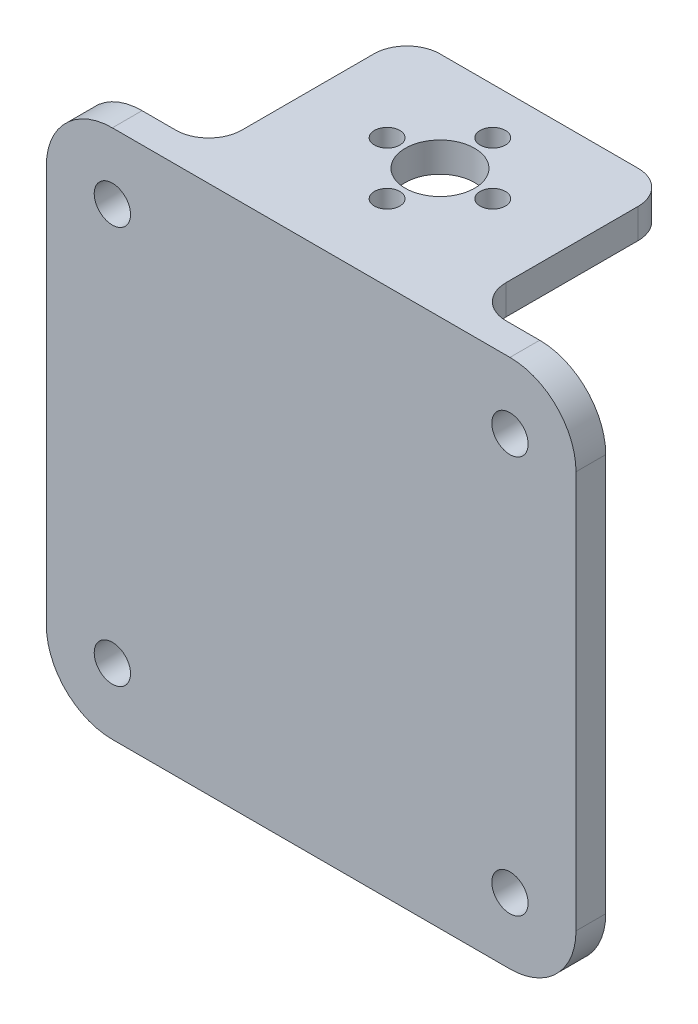
ISO-10303-21;
HEADER;
FILE_DESCRIPTION(('STEP AP214'),'2;1');
FILE_NAME('part.step','',(''),(''),'','','');
FILE_SCHEMA(('AUTOMOTIVE_DESIGN { 1 0 10303 214 1 1 1 1 }'));
ENDSEC;
DATA;
#1=APPLICATION_CONTEXT('core data for automotive mechanical design processes');
#2=APPLICATION_PROTOCOL_DEFINITION('international standard','automotive_design',2000,#1);
#3=PRODUCT_CONTEXT('',#1,'mechanical');
#4=PRODUCT('Part','Part','',(#3));
#5=PRODUCT_RELATED_PRODUCT_CATEGORY('part','',(#4));
#6=PRODUCT_DEFINITION_FORMATION('','',#4);
#7=PRODUCT_DEFINITION_CONTEXT('part definition',#1,'design');
#8=PRODUCT_DEFINITION('design','',#6,#7);
#9=PRODUCT_DEFINITION_SHAPE('','',#8);
#10=(LENGTH_UNIT() NAMED_UNIT(*) SI_UNIT(.MILLI.,.METRE.));
#11=(NAMED_UNIT(*) PLANE_ANGLE_UNIT() SI_UNIT($,.RADIAN.));
#12=(NAMED_UNIT(*) SI_UNIT($,.STERADIAN.) SOLID_ANGLE_UNIT());
#13=UNCERTAINTY_MEASURE_WITH_UNIT(LENGTH_MEASURE(1.E-05),#10,'distance_accuracy_value','');
#14=(GEOMETRIC_REPRESENTATION_CONTEXT(3) GLOBAL_UNCERTAINTY_ASSIGNED_CONTEXT((#13)) GLOBAL_UNIT_ASSIGNED_CONTEXT((#10,
#11,#12)) REPRESENTATION_CONTEXT('',''));
#15=CARTESIAN_POINT('',(0.,0.,0.));
#16=DIRECTION('',(0.,0.,1.));
#17=DIRECTION('',(1.,0.,0.));
#18=AXIS2_PLACEMENT_3D('',#15,#16,#17);
#19=CARTESIAN_POINT('',(-20.,30.6,-5.));
#20=DIRECTION('',(-1.,0.,0.));
#21=DIRECTION('',(0.,0.,1.));
#22=AXIS2_PLACEMENT_3D('',#19,#20,#21);
#23=CYLINDRICAL_SURFACE('',#22,5.);
#24=CARTESIAN_POINT('',(-5.15388203202207,35.6,-5.));
#25=CARTESIAN_POINT('',(-5.01631585307418,35.5999913520222,-4.92909748437577));
#26=CARTESIAN_POINT('',(-4.87729618481996,35.5984918317113,-4.86104360331751));
#27=CARTESIAN_POINT('',(-4.59662063585491,35.5931730594894,-4.73074971215315));
#28=CARTESIAN_POINT('',(-4.45496507521269,35.5893540874635,-4.66850900162467));
#29=CARTESIAN_POINT('',(-4.16928792933621,35.5800591686286,-4.5499544788145));
#30=CARTESIAN_POINT('',(-4.02526689375377,35.5745836017426,-4.49363931155772));
#31=CARTESIAN_POINT('',(-3.73507167214751,35.5625711685309,-4.38700593165495));
#32=CARTESIAN_POINT('',(-3.58889741871085,35.5560342689127,-4.33668790721748));
#33=CARTESIAN_POINT('',(-3.14793667536414,35.5356971252103,-4.19499227552404));
#34=CARTESIAN_POINT('',(-2.85021765370454,35.521150451921,-4.11266800465306));
#35=CARTESIAN_POINT('',(-2.24896964163665,35.4938599669087,-3.9727640340968));
#36=CARTESIAN_POINT('',(-1.94544052656638,35.4811161939182,-3.91518486596805));
#37=CARTESIAN_POINT('',(-1.33022773066185,35.4600921647358,-3.82453626447683));
#38=CARTESIAN_POINT('',(-1.01848936514312,35.4518767149964,-3.79182027441572));
#39=CARTESIAN_POINT('',(-0.393262608097474,35.4419203855534,-3.75251326105764));
#40=CARTESIAN_POINT('',(-0.0797742174207513,35.4401795027047,-3.74592222506991));
#41=CARTESIAN_POINT('',(0.546542452032286,35.4435278052012,-3.75891990886592));
#42=CARTESIAN_POINT('',(0.859370871986203,35.4486153405969,-3.77850230436263));
#43=CARTESIAN_POINT('',(1.4821451200631,35.4645675365453,-3.84366708453228));
#44=CARTESIAN_POINT('',(1.79209106484402,35.4754319622545,-3.88924841229596));
#45=CARTESIAN_POINT('',(2.36483910949621,35.4988481249681,-3.99804573617424));
#46=CARTESIAN_POINT('',(2.62828650735949,35.5109652759137,-4.05799343173408));
#47=CARTESIAN_POINT('',(3.1501282352049,35.5355457485927,-4.19666400796702));
#48=CARTESIAN_POINT('',(3.40852341513045,35.5480090112303,-4.27538370067178));
#49=CARTESIAN_POINT('',(3.91920957374872,35.5705919525803,-4.45129194136026));
#50=CARTESIAN_POINT('',(4.17149803584348,35.5807106793465,-4.54848796218717));
#51=CARTESIAN_POINT('',(4.54430028552803,35.5917355745811,-4.70776416277608));
#52=CARTESIAN_POINT('',(4.66766066692802,35.5947185758424,-4.76311942076407));
#53=CARTESIAN_POINT('',(4.91234180293186,35.5988488127952,-4.87825703348604));
#54=CARTESIAN_POINT('',(5.0336623689234,35.59999587964,-4.93803979487847));
#55=CARTESIAN_POINT('',(5.15388203202208,35.6,-5.));
#56=B_SPLINE_CURVE_WITH_KNOTS('',3,(#24,#25,#26,#27,#28,#29,#30,#31,#32,#33,#34,#35,#36,#37,#38,
#39,#40,#41,#42,#43,#44,#45,#46,#47,#48,#49,#50,#51,#52,#53,#54,#55),.UNSPECIFIED.,.F.,.F.,(4,2,
2,2,2,2,2,2,2,2,2,2,2,2,2,4),(0.,0.464230022958836,0.928404039009597,1.39247168213864,
1.85655388528336,2.78311591250001,3.70969784246144,4.64921720773792,5.58873611662203,
6.52802805055899,7.46728180309712,8.27795648921143,9.08849359981811,9.89935923640951,
10.3050032539503,10.7106845755039),.UNSPECIFIED.);
#57=CARTESIAN_POINT('',(-5.15388203202208,35.6,-5.));
#58=VERTEX_POINT('',#57);
#59=CARTESIAN_POINT('',(5.15388203202208,35.6,-5.));
#60=VERTEX_POINT('',#59);
#61=EDGE_CURVE('E160',#58,#60,#56,.T.);
#62=ORIENTED_EDGE('',*,*,#61,.T.);
#63=DIRECTION('',(-1.,0.,0.));
#64=VECTOR('',#63,1.);
#65=CARTESIAN_POINT('',(-20.,35.6,-5.));
#66=LINE('',#65,#64);
#67=CARTESIAN_POINT('',(20.,35.6,-5.));
#68=VERTEX_POINT('',#67);
#69=EDGE_CURVE('E168',#68,#60,#66,.T.);
#70=ORIENTED_EDGE('',*,*,#69,.F.);
#71=CARTESIAN_POINT('',(25.,30.6,-5.));
#72=DIRECTION('',(-0.707106781186548,-0.707106781186547,0.));
#73=DIRECTION('',(-0.707106781186547,0.707106781186548,0.));
#74=AXIS2_PLACEMENT_3D('',#71,#72,#73);
#75=ELLIPSE('',#74,7.07106781186547,5.);
#76=CARTESIAN_POINT('',(25.,30.6,0.));
#77=VERTEX_POINT('',#76);
#78=EDGE_CURVE('E47',#68,#77,#75,.F.);
#79=ORIENTED_EDGE('',*,*,#78,.T.);
#80=DIRECTION('',(-1.,0.,0.));
#81=VECTOR('',#80,1.);
#82=CARTESIAN_POINT('',(0.,30.6,0.));
#83=LINE('',#82,#81);
#84=CARTESIAN_POINT('',(-25.,30.6,0.));
#85=VERTEX_POINT('',#84);
#86=EDGE_CURVE('E60',#85,#77,#83,.F.);
#87=ORIENTED_EDGE('',*,*,#86,.F.);
#88=CARTESIAN_POINT('',(-25.,30.6,-5.));
#89=DIRECTION('',(-0.707106781186548,0.707106781186547,0.));
#90=DIRECTION('',(-0.707106781186547,-0.707106781186548,0.));
#91=AXIS2_PLACEMENT_3D('',#88,#89,#90);
#92=ELLIPSE('',#91,7.07106781186547,5.);
#93=CARTESIAN_POINT('',(-20.,35.6,-5.));
#94=VERTEX_POINT('',#93);
#95=EDGE_CURVE('E212',#85,#94,#92,.T.);
#96=ORIENTED_EDGE('',*,*,#95,.T.);
#97=EDGE_CURVE('E169',#58,#94,#66,.T.);
#98=ORIENTED_EDGE('',*,*,#97,.F.);
#99=EDGE_LOOP('',(#62,#70,#79,#87,#96,#98));
#100=FACE_BOUND('',#99,.T.);
#101=ADVANCED_FACE('F39',(#100),#23,.F.);
#102=CARTESIAN_POINT('',(40.1,-40.1,4.5));
#103=DIRECTION('',(-1.,0.,0.));
#104=DIRECTION('',(0.,0.,1.));
#105=AXIS2_PLACEMENT_3D('',#102,#103,#104);
#106=PLANE('',#105);
#107=DIRECTION('',(0.,1.,0.));
#108=VECTOR('',#107,1.);
#109=CARTESIAN_POINT('',(40.1,-40.1,4.5));
#110=LINE('',#109,#108);
#111=CARTESIAN_POINT('',(40.1,-30.1,4.5));
#112=VERTEX_POINT('',#111);
#113=CARTESIAN_POINT('',(40.1,30.1,4.5));
#114=VERTEX_POINT('',#113);
#115=EDGE_CURVE('E240',#112,#114,#110,.T.);
#116=ORIENTED_EDGE('',*,*,#115,.F.);
#117=DIRECTION('',(0.,0.,-1.));
#118=VECTOR('',#117,1.);
#119=CARTESIAN_POINT('',(40.1,-30.1,4.5));
#120=LINE('',#119,#118);
#121=CARTESIAN_POINT('',(40.1,-30.1,0.));
#122=VERTEX_POINT('',#121);
#123=EDGE_CURVE('E243',#112,#122,#120,.T.);
#124=ORIENTED_EDGE('',*,*,#123,.T.);
#125=DIRECTION('',(0.,1.,0.));
#126=VECTOR('',#125,1.);
#127=CARTESIAN_POINT('',(40.1,-40.1,0.));
#128=LINE('',#127,#126);
#129=CARTESIAN_POINT('',(40.1,30.1,0.));
#130=VERTEX_POINT('',#129);
#131=EDGE_CURVE('E234',#122,#130,#128,.T.);
#132=ORIENTED_EDGE('',*,*,#131,.T.);
#133=DIRECTION('',(0.,0.,-1.));
#134=VECTOR('',#133,1.);
#135=CARTESIAN_POINT('',(40.1,30.1,4.5));
#136=LINE('',#135,#134);
#137=EDGE_CURVE('E241',#130,#114,#136,.F.);
#138=ORIENTED_EDGE('',*,*,#137,.T.);
#139=EDGE_LOOP('',(#116,#124,#132,#138));
#140=FACE_BOUND('',#139,.T.);
#141=ADVANCED_FACE('F448',(#140),#106,.F.);
#142=CARTESIAN_POINT('',(-40.1,40.1,4.5));
#143=DIRECTION('',(0.,-1.,0.));
#144=DIRECTION('',(0.,0.,-1.));
#145=AXIS2_PLACEMENT_3D('',#142,#143,#144);
#146=PLANE('',#145);
#147=CARTESIAN_POINT('',(0.,40.1,-23.));
#148=DIRECTION('',(0.,-1.,0.));
#149=DIRECTION('',(0.,0.,-1.));
#150=AXIS2_PLACEMENT_3D('',#147,#148,#149);
#151=CIRCLE('',#150,1.92451726462189);
#152=CARTESIAN_POINT('',(0.,40.1,-24.9245172646219));
#153=VERTEX_POINT('',#152);
#154=EDGE_CURVE('E351',#153,#153,#151,.F.);
#155=ORIENTED_EDGE('',*,*,#154,.F.);
#156=EDGE_LOOP('',(#155));
#157=FACE_BOUND('',#156,.T.);
#158=CARTESIAN_POINT('',(-8.,40.1,-15.));
#159=DIRECTION('',(0.,-1.,0.));
#160=DIRECTION('',(0.,0.,-1.));
#161=AXIS2_PLACEMENT_3D('',#158,#159,#160);
#162=CIRCLE('',#161,1.92451726462189);
#163=CARTESIAN_POINT('',(-8.,40.1,-16.9245172646219));
#164=VERTEX_POINT('',#163);
#165=EDGE_CURVE('E364',#164,#164,#162,.F.);
#166=ORIENTED_EDGE('',*,*,#165,.F.);
#167=EDGE_LOOP('',(#166));
#168=FACE_BOUND('',#167,.T.);
#169=CARTESIAN_POINT('',(0.,40.1,-7.));
#170=DIRECTION('',(0.,-1.,0.));
#171=DIRECTION('',(0.,0.,-1.));
#172=AXIS2_PLACEMENT_3D('',#169,#170,#171);
#173=CIRCLE('',#172,1.92451726462189);
#174=CARTESIAN_POINT('',(0.,40.1,-8.9245172646219));
#175=VERTEX_POINT('',#174);
#176=EDGE_CURVE('E358',#175,#175,#173,.F.);
#177=ORIENTED_EDGE('',*,*,#176,.F.);
#178=EDGE_LOOP('',(#177));
#179=FACE_BOUND('',#178,.T.);
#180=CARTESIAN_POINT('',(8.,40.1,-15.));
#181=DIRECTION('',(0.,-1.,0.));
#182=DIRECTION('',(0.,0.,-1.));
#183=AXIS2_PLACEMENT_3D('',#180,#181,#182);
#184=CIRCLE('',#183,1.92451726462189);
#185=CARTESIAN_POINT('',(8.,40.1,-16.9245172646219));
#186=VERTEX_POINT('',#185);
#187=EDGE_CURVE('E352',#186,#186,#184,.F.);
#188=ORIENTED_EDGE('',*,*,#187,.F.);
#189=EDGE_LOOP('',(#188));
#190=FACE_BOUND('',#189,.T.);
#191=CARTESIAN_POINT('',(0.,40.1,-15.));
#192=DIRECTION('',(0.,-1.,0.));
#193=DIRECTION('',(0.,0.,-1.));
#194=AXIS2_PLACEMENT_3D('',#191,#192,#193);
#195=CIRCLE('',#194,5.25);
#196=CARTESIAN_POINT('',(0.,40.1,-20.25));
#197=VERTEX_POINT('',#196);
#198=EDGE_CURVE('E345',#197,#197,#195,.F.);
#199=ORIENTED_EDGE('',*,*,#198,.F.);
#200=EDGE_LOOP('',(#199));
#201=FACE_BOUND('',#200,.T.);
#202=DIRECTION('',(1.,0.,0.));
#203=VECTOR('',#202,1.);
#204=CARTESIAN_POINT('',(-20.,40.1,-30.));
#205=LINE('',#204,#203);
#206=CARTESIAN_POINT('',(-15.,40.1,-30.));
#207=VERTEX_POINT('',#206);
#208=CARTESIAN_POINT('',(15.,40.1,-30.));
#209=VERTEX_POINT('',#208);
#210=EDGE_CURVE('E342',#207,#209,#205,.T.);
#211=ORIENTED_EDGE('',*,*,#210,.F.);
#212=CARTESIAN_POINT('',(-15.,40.1,-25.));
#213=DIRECTION('',(0.,-1.,0.));
#214=DIRECTION('',(0.,0.,-1.));
#215=AXIS2_PLACEMENT_3D('',#212,#213,#214);
#216=CIRCLE('',#215,5.);
#217=CARTESIAN_POINT('',(-20.,40.1,-25.));
#218=VERTEX_POINT('',#217);
#219=EDGE_CURVE('E190',#207,#218,#216,.F.);
#220=ORIENTED_EDGE('',*,*,#219,.T.);
#221=DIRECTION('',(0.,0.,1.));
#222=VECTOR('',#221,1.);
#223=CARTESIAN_POINT('',(-20.,40.1,-30.));
#224=LINE('',#223,#222);
#225=CARTESIAN_POINT('',(-20.,40.1,-5.));
#226=VERTEX_POINT('',#225);
#227=EDGE_CURVE('E330',#218,#226,#224,.T.);
#228=ORIENTED_EDGE('',*,*,#227,.T.);
#229=CARTESIAN_POINT('',(-25.,40.1,-5.));
#230=DIRECTION('',(0.,-1.,0.));
#231=DIRECTION('',(0.,0.,-1.));
#232=AXIS2_PLACEMENT_3D('',#229,#230,#231);
#233=CIRCLE('',#232,5.);
#234=CARTESIAN_POINT('',(-25.,40.1,0.));
#235=VERTEX_POINT('',#234);
#236=EDGE_CURVE('E210',#226,#235,#233,.T.);
#237=ORIENTED_EDGE('',*,*,#236,.T.);
#238=DIRECTION('',(-1.,0.,0.));
#239=VECTOR('',#238,1.);
#240=CARTESIAN_POINT('',(-40.1,40.1,0.));
#241=LINE('',#240,#239);
#242=CARTESIAN_POINT('',(-30.1,40.1,0.));
#243=VERTEX_POINT('',#242);
#244=EDGE_CURVE('E229',#235,#243,#241,.T.);
#245=ORIENTED_EDGE('',*,*,#244,.T.);
#246=DIRECTION('',(0.,0.,-1.));
#247=VECTOR('',#246,1.);
#248=CARTESIAN_POINT('',(-30.1,40.1,4.5));
#249=LINE('',#248,#247);
#250=CARTESIAN_POINT('',(-30.1,40.1,4.5));
#251=VERTEX_POINT('',#250);
#252=EDGE_CURVE('E179',#243,#251,#249,.F.);
#253=ORIENTED_EDGE('',*,*,#252,.T.);
#254=DIRECTION('',(-1.,0.,0.));
#255=VECTOR('',#254,1.);
#256=CARTESIAN_POINT('',(-40.1,40.1,4.5));
#257=LINE('',#256,#255);
#258=CARTESIAN_POINT('',(30.1,40.1,4.5));
#259=VERTEX_POINT('',#258);
#260=EDGE_CURVE('E275',#259,#251,#257,.T.);
#261=ORIENTED_EDGE('',*,*,#260,.F.);
#262=DIRECTION('',(0.,0.,-1.));
#263=VECTOR('',#262,1.);
#264=CARTESIAN_POINT('',(30.1,40.1,4.5));
#265=LINE('',#264,#263);
#266=CARTESIAN_POINT('',(30.1,40.1,0.));
#267=VERTEX_POINT('',#266);
#268=EDGE_CURVE('E227',#259,#267,#265,.T.);
#269=ORIENTED_EDGE('',*,*,#268,.T.);
#270=CARTESIAN_POINT('',(25.,40.1,0.));
#271=VERTEX_POINT('',#270);
#272=EDGE_CURVE('E221',#267,#271,#241,.T.);
#273=ORIENTED_EDGE('',*,*,#272,.T.);
#274=CARTESIAN_POINT('',(25.,40.1,-5.));
#275=DIRECTION('',(0.,-1.,0.));
#276=DIRECTION('',(0.,0.,-1.));
#277=AXIS2_PLACEMENT_3D('',#274,#275,#276);
#278=CIRCLE('',#277,5.);
#279=CARTESIAN_POINT('',(20.,40.1,-5.));
#280=VERTEX_POINT('',#279);
#281=EDGE_CURVE('E11',#271,#280,#278,.T.);
#282=ORIENTED_EDGE('',*,*,#281,.T.);
#283=DIRECTION('',(0.,0.,1.));
#284=VECTOR('',#283,1.);
#285=CARTESIAN_POINT('',(20.,40.1,-30.));
#286=LINE('',#285,#284);
#287=CARTESIAN_POINT('',(20.,40.1,-25.));
#288=VERTEX_POINT('',#287);
#289=EDGE_CURVE('E333',#288,#280,#286,.T.);
#290=ORIENTED_EDGE('',*,*,#289,.F.);
#291=CARTESIAN_POINT('',(15.,40.1,-25.));
#292=DIRECTION('',(0.,-1.,0.));
#293=DIRECTION('',(0.,0.,-1.));
#294=AXIS2_PLACEMENT_3D('',#291,#292,#293);
#295=CIRCLE('',#294,5.);
#296=EDGE_CURVE('E188',#288,#209,#295,.F.);
#297=ORIENTED_EDGE('',*,*,#296,.T.);
#298=EDGE_LOOP('',(#211,#220,#228,#237,#245,#253,#261,#269,#273,#282,#290,#297));
#299=FACE_BOUND('',#298,.T.);
#300=ADVANCED_FACE('F224',(#157,#168,#179,#190,#201,#299),#146,.F.);
#301=CARTESIAN_POINT('',(-40.1,-40.1,4.5));
#302=DIRECTION('',(1.,0.,0.));
#303=DIRECTION('',(0.,0.,-1.));
#304=AXIS2_PLACEMENT_3D('',#301,#302,#303);
#305=PLANE('',#304);
#306=DIRECTION('',(0.,-1.,0.));
#307=VECTOR('',#306,1.);
#308=CARTESIAN_POINT('',(-40.1,-40.1,0.));
#309=LINE('',#308,#307);
#310=CARTESIAN_POINT('',(-40.1,30.1,0.));
#311=VERTEX_POINT('',#310);
#312=CARTESIAN_POINT('',(-40.1,-30.1,0.));
#313=VERTEX_POINT('',#312);
#314=EDGE_CURVE('E228',#311,#313,#309,.T.);
#315=ORIENTED_EDGE('',*,*,#314,.T.);
#316=DIRECTION('',(0.,0.,-1.));
#317=VECTOR('',#316,1.);
#318=CARTESIAN_POINT('',(-40.1,-30.1,4.5));
#319=LINE('',#318,#317);
#320=CARTESIAN_POINT('',(-40.1,-30.1,4.5));
#321=VERTEX_POINT('',#320);
#322=EDGE_CURVE('E272',#313,#321,#319,.F.);
#323=ORIENTED_EDGE('',*,*,#322,.T.);
#324=DIRECTION('',(0.,-1.,0.));
#325=VECTOR('',#324,1.);
#326=CARTESIAN_POINT('',(-40.1,-40.1,4.5));
#327=LINE('',#326,#325);
#328=CARTESIAN_POINT('',(-40.1,30.1,4.5));
#329=VERTEX_POINT('',#328);
#330=EDGE_CURVE('E285',#329,#321,#327,.T.);
#331=ORIENTED_EDGE('',*,*,#330,.F.);
#332=DIRECTION('',(0.,0.,-1.));
#333=VECTOR('',#332,1.);
#334=CARTESIAN_POINT('',(-40.1,30.1,4.5));
#335=LINE('',#334,#333);
#336=EDGE_CURVE('E269',#329,#311,#335,.T.);
#337=ORIENTED_EDGE('',*,*,#336,.T.);
#338=EDGE_LOOP('',(#315,#323,#331,#337));
#339=FACE_BOUND('',#338,.T.);
#340=ADVANCED_FACE('F291',(#339),#305,.F.);
#341=CARTESIAN_POINT('',(-40.1,-40.1,4.5));
#342=DIRECTION('',(0.,1.,0.));
#343=DIRECTION('',(0.,0.,1.));
#344=AXIS2_PLACEMENT_3D('',#341,#342,#343);
#345=PLANE('',#344);
#346=DIRECTION('',(1.,0.,0.));
#347=VECTOR('',#346,1.);
#348=CARTESIAN_POINT('',(-40.1,-40.1,0.));
#349=LINE('',#348,#347);
#350=CARTESIAN_POINT('',(-30.1,-40.1,0.));
#351=VERTEX_POINT('',#350);
#352=CARTESIAN_POINT('',(30.1,-40.1,0.));
#353=VERTEX_POINT('',#352);
#354=EDGE_CURVE('E232',#351,#353,#349,.T.);
#355=ORIENTED_EDGE('',*,*,#354,.T.);
#356=DIRECTION('',(0.,0.,-1.));
#357=VECTOR('',#356,1.);
#358=CARTESIAN_POINT('',(30.1,-40.1,4.5));
#359=LINE('',#358,#357);
#360=CARTESIAN_POINT('',(30.1,-40.1,4.5));
#361=VERTEX_POINT('',#360);
#362=EDGE_CURVE('E259',#353,#361,#359,.F.);
#363=ORIENTED_EDGE('',*,*,#362,.T.);
#364=DIRECTION('',(1.,0.,0.));
#365=VECTOR('',#364,1.);
#366=CARTESIAN_POINT('',(-40.1,-40.1,4.5));
#367=LINE('',#366,#365);
#368=CARTESIAN_POINT('',(-30.1,-40.1,4.5));
#369=VERTEX_POINT('',#368);
#370=EDGE_CURVE('E244',#369,#361,#367,.T.);
#371=ORIENTED_EDGE('',*,*,#370,.F.);
#372=DIRECTION('',(0.,0.,-1.));
#373=VECTOR('',#372,1.);
#374=CARTESIAN_POINT('',(-30.1,-40.1,4.5));
#375=LINE('',#374,#373);
#376=EDGE_CURVE('E256',#369,#351,#375,.T.);
#377=ORIENTED_EDGE('',*,*,#376,.T.);
#378=EDGE_LOOP('',(#355,#363,#371,#377));
#379=FACE_BOUND('',#378,.T.);
#380=ADVANCED_FACE('F300',(#379),#345,.F.);
#381=CARTESIAN_POINT('',(0.,0.,4.5));
#382=DIRECTION('',(0.,0.,-1.));
#383=DIRECTION('',(-1.,0.,0.));
#384=AXIS2_PLACEMENT_3D('',#381,#382,#383);
#385=PLANE('',#384);
#386=CARTESIAN_POINT('',(30.1,30.1,4.5));
#387=DIRECTION('',(0.,0.,-1.));
#388=DIRECTION('',(-1.,0.,0.));
#389=AXIS2_PLACEMENT_3D('',#386,#387,#388);
#390=CIRCLE('',#389,2.74999999999999);
#391=CARTESIAN_POINT('',(27.35,30.1,4.5));
#392=VERTEX_POINT('',#391);
#393=EDGE_CURVE('E324',#392,#392,#390,.T.);
#394=ORIENTED_EDGE('',*,*,#393,.T.);
#395=EDGE_LOOP('',(#394));
#396=FACE_BOUND('',#395,.T.);
#397=CARTESIAN_POINT('',(-30.1,30.1,4.5));
#398=DIRECTION('',(0.,0.,-1.));
#399=DIRECTION('',(-1.,0.,0.));
#400=AXIS2_PLACEMENT_3D('',#397,#398,#399);
#401=CIRCLE('',#400,2.75);
#402=CARTESIAN_POINT('',(-32.85,30.1,4.5));
#403=VERTEX_POINT('',#402);
#404=EDGE_CURVE('E318',#403,#403,#401,.T.);
#405=ORIENTED_EDGE('',*,*,#404,.T.);
#406=EDGE_LOOP('',(#405));
#407=FACE_BOUND('',#406,.T.);
#408=CARTESIAN_POINT('',(30.1,-30.1,4.5));
#409=DIRECTION('',(0.,0.,-1.));
#410=DIRECTION('',(-1.,0.,0.));
#411=AXIS2_PLACEMENT_3D('',#408,#409,#410);
#412=CIRCLE('',#411,2.75);
#413=CARTESIAN_POINT('',(27.35,-30.1,4.5));
#414=VERTEX_POINT('',#413);
#415=EDGE_CURVE('E312',#414,#414,#412,.T.);
#416=ORIENTED_EDGE('',*,*,#415,.T.);
#417=EDGE_LOOP('',(#416));
#418=FACE_BOUND('',#417,.T.);
#419=CARTESIAN_POINT('',(-30.1,-30.1,4.5));
#420=DIRECTION('',(0.,0.,-1.));
#421=DIRECTION('',(-1.,0.,0.));
#422=AXIS2_PLACEMENT_3D('',#419,#420,#421);
#423=CIRCLE('',#422,2.75);
#424=CARTESIAN_POINT('',(-32.85,-30.1,4.5));
#425=VERTEX_POINT('',#424);
#426=EDGE_CURVE('E306',#425,#425,#423,.T.);
#427=ORIENTED_EDGE('',*,*,#426,.T.);
#428=EDGE_LOOP('',(#427));
#429=FACE_BOUND('',#428,.T.);
#430=ORIENTED_EDGE('',*,*,#370,.T.);
#431=CARTESIAN_POINT('',(30.1,-30.1,4.5));
#432=DIRECTION('',(0.,0.,-1.));
#433=DIRECTION('',(-1.,0.,0.));
#434=AXIS2_PLACEMENT_3D('',#431,#432,#433);
#435=CIRCLE('',#434,10.);
#436=EDGE_CURVE('E267',#361,#112,#435,.F.);
#437=ORIENTED_EDGE('',*,*,#436,.T.);
#438=ORIENTED_EDGE('',*,*,#115,.T.);
#439=CARTESIAN_POINT('',(30.1,30.1,4.5));
#440=DIRECTION('',(0.,0.,-1.));
#441=DIRECTION('',(-1.,0.,0.));
#442=AXIS2_PLACEMENT_3D('',#439,#440,#441);
#443=CIRCLE('',#442,10.);
#444=EDGE_CURVE('E261',#114,#259,#443,.F.);
#445=ORIENTED_EDGE('',*,*,#444,.T.);
#446=ORIENTED_EDGE('',*,*,#260,.T.);
#447=CARTESIAN_POINT('',(-30.1,30.1,4.5));
#448=DIRECTION('',(0.,0.,-1.));
#449=DIRECTION('',(-1.,0.,0.));
#450=AXIS2_PLACEMENT_3D('',#447,#448,#449);
#451=CIRCLE('',#450,10.);
#452=EDGE_CURVE('E263',#251,#329,#451,.F.);
#453=ORIENTED_EDGE('',*,*,#452,.T.);
#454=ORIENTED_EDGE('',*,*,#330,.T.);
#455=CARTESIAN_POINT('',(-30.1,-30.1,4.5));
#456=DIRECTION('',(0.,0.,-1.));
#457=DIRECTION('',(-1.,0.,0.));
#458=AXIS2_PLACEMENT_3D('',#455,#456,#457);
#459=CIRCLE('',#458,10.);
#460=EDGE_CURVE('E265',#321,#369,#459,.F.);
#461=ORIENTED_EDGE('',*,*,#460,.T.);
#462=EDGE_LOOP('',(#430,#437,#438,#445,#446,#453,#454,#461));
#463=FACE_BOUND('',#462,.T.);
#464=ADVANCED_FACE('F280',(#396,#407,#418,#429,#463),#385,.F.);
#465=CARTESIAN_POINT('',(0.,0.,0.));
#466=DIRECTION('',(0.,0.,-1.));
#467=DIRECTION('',(-1.,0.,0.));
#468=AXIS2_PLACEMENT_3D('',#465,#466,#467);
#469=PLANE('',#468);
#470=ORIENTED_EDGE('',*,*,#244,.F.);
#471=DIRECTION('',(0.,1.,0.));
#472=VECTOR('',#471,1.);
#473=CARTESIAN_POINT('',(-25.,0.,0.));
#474=LINE('',#473,#472);
#475=EDGE_CURVE('E205',#235,#85,#474,.F.);
#476=ORIENTED_EDGE('',*,*,#475,.T.);
#477=ORIENTED_EDGE('',*,*,#86,.T.);
#478=DIRECTION('',(0.,-1.,0.));
#479=VECTOR('',#478,1.);
#480=CARTESIAN_POINT('',(25.,0.,0.));
#481=LINE('',#480,#479);
#482=EDGE_CURVE('E203',#77,#271,#481,.F.);
#483=ORIENTED_EDGE('',*,*,#482,.T.);
#484=ORIENTED_EDGE('',*,*,#272,.F.);
#485=CARTESIAN_POINT('',(30.1,30.1,0.));
#486=DIRECTION('',(0.,0.,-1.));
#487=DIRECTION('',(-1.,0.,0.));
#488=AXIS2_PLACEMENT_3D('',#485,#486,#487);
#489=CIRCLE('',#488,10.);
#490=EDGE_CURVE('E247',#267,#130,#489,.T.);
#491=ORIENTED_EDGE('',*,*,#490,.T.);
#492=ORIENTED_EDGE('',*,*,#131,.F.);
#493=CARTESIAN_POINT('',(30.1,-30.1,0.));
#494=DIRECTION('',(0.,0.,-1.));
#495=DIRECTION('',(-1.,0.,0.));
#496=AXIS2_PLACEMENT_3D('',#493,#494,#495);
#497=CIRCLE('',#496,10.);
#498=EDGE_CURVE('E254',#122,#353,#497,.T.);
#499=ORIENTED_EDGE('',*,*,#498,.T.);
#500=ORIENTED_EDGE('',*,*,#354,.F.);
#501=CARTESIAN_POINT('',(-30.1,-30.1,0.));
#502=DIRECTION('',(0.,0.,-1.));
#503=DIRECTION('',(-1.,0.,0.));
#504=AXIS2_PLACEMENT_3D('',#501,#502,#503);
#505=CIRCLE('',#504,10.);
#506=EDGE_CURVE('E252',#351,#313,#505,.T.);
#507=ORIENTED_EDGE('',*,*,#506,.T.);
#508=ORIENTED_EDGE('',*,*,#314,.F.);
#509=CARTESIAN_POINT('',(-30.1,30.1,0.));
#510=DIRECTION('',(0.,0.,-1.));
#511=DIRECTION('',(-1.,0.,0.));
#512=AXIS2_PLACEMENT_3D('',#509,#510,#511);
#513=CIRCLE('',#512,10.);
#514=EDGE_CURVE('E249',#311,#243,#513,.T.);
#515=ORIENTED_EDGE('',*,*,#514,.T.);
#516=EDGE_LOOP('',(#470,#476,#477,#483,#484,#491,#492,#499,#500,#507,#508,#515));
#517=FACE_BOUND('',#516,.T.);
#518=CARTESIAN_POINT('',(30.1,30.1,0.));
#519=DIRECTION('',(0.,0.,-1.));
#520=DIRECTION('',(-1.,0.,0.));
#521=AXIS2_PLACEMENT_3D('',#518,#519,#520);
#522=CIRCLE('',#521,2.74999999999998);
#523=CARTESIAN_POINT('',(27.35,30.1,0.));
#524=VERTEX_POINT('',#523);
#525=EDGE_CURVE('E327',#524,#524,#522,.T.);
#526=ORIENTED_EDGE('',*,*,#525,.F.);
#527=EDGE_LOOP('',(#526));
#528=FACE_BOUND('',#527,.T.);
#529=CARTESIAN_POINT('',(-30.1,30.1,0.));
#530=DIRECTION('',(0.,0.,-1.));
#531=DIRECTION('',(-1.,0.,0.));
#532=AXIS2_PLACEMENT_3D('',#529,#530,#531);
#533=CIRCLE('',#532,2.74999999999999);
#534=CARTESIAN_POINT('',(-32.85,30.1,0.));
#535=VERTEX_POINT('',#534);
#536=EDGE_CURVE('E321',#535,#535,#533,.T.);
#537=ORIENTED_EDGE('',*,*,#536,.F.);
#538=EDGE_LOOP('',(#537));
#539=FACE_BOUND('',#538,.T.);
#540=CARTESIAN_POINT('',(30.1,-30.1,0.));
#541=DIRECTION('',(0.,0.,-1.));
#542=DIRECTION('',(-1.,0.,0.));
#543=AXIS2_PLACEMENT_3D('',#540,#541,#542);
#544=CIRCLE('',#543,2.74999999999999);
#545=CARTESIAN_POINT('',(27.35,-30.1,0.));
#546=VERTEX_POINT('',#545);
#547=EDGE_CURVE('E315',#546,#546,#544,.T.);
#548=ORIENTED_EDGE('',*,*,#547,.F.);
#549=EDGE_LOOP('',(#548));
#550=FACE_BOUND('',#549,.T.);
#551=CARTESIAN_POINT('',(-30.1,-30.1,0.));
#552=DIRECTION('',(0.,0.,-1.));
#553=DIRECTION('',(-1.,0.,0.));
#554=AXIS2_PLACEMENT_3D('',#551,#552,#553);
#555=CIRCLE('',#554,2.74999999999999);
#556=CARTESIAN_POINT('',(-32.85,-30.1,0.));
#557=VERTEX_POINT('',#556);
#558=EDGE_CURVE('E309',#557,#557,#555,.T.);
#559=ORIENTED_EDGE('',*,*,#558,.F.);
#560=EDGE_LOOP('',(#559));
#561=FACE_BOUND('',#560,.T.);
#562=ADVANCED_FACE('F219',(#517,#528,#539,#550,#561),#469,.T.);
#563=CARTESIAN_POINT('',(-30.1,-30.1,0.));
#564=DIRECTION('',(0.,0.,-1.));
#565=DIRECTION('',(-1.,0.,0.));
#566=AXIS2_PLACEMENT_3D('',#563,#564,#565);
#567=CYLINDRICAL_SURFACE('',#566,2.74999999999999);
#568=ORIENTED_EDGE('',*,*,#426,.F.);
#569=EDGE_LOOP('',(#568));
#570=FACE_BOUND('',#569,.T.);
#571=ORIENTED_EDGE('',*,*,#558,.T.);
#572=EDGE_LOOP('',(#571));
#573=FACE_BOUND('',#572,.T.);
#574=ADVANCED_FACE('F432',(#570,#573),#567,.F.);
#575=CARTESIAN_POINT('',(30.1,-30.1,0.));
#576=DIRECTION('',(0.,0.,-1.));
#577=DIRECTION('',(-1.,0.,0.));
#578=AXIS2_PLACEMENT_3D('',#575,#576,#577);
#579=CYLINDRICAL_SURFACE('',#578,2.74999999999999);
#580=ORIENTED_EDGE('',*,*,#415,.F.);
#581=EDGE_LOOP('',(#580));
#582=FACE_BOUND('',#581,.T.);
#583=ORIENTED_EDGE('',*,*,#547,.T.);
#584=EDGE_LOOP('',(#583));
#585=FACE_BOUND('',#584,.T.);
#586=ADVANCED_FACE('F428',(#582,#585),#579,.F.);
#587=CARTESIAN_POINT('',(-30.1,30.1,0.));
#588=DIRECTION('',(0.,0.,-1.));
#589=DIRECTION('',(-1.,0.,0.));
#590=AXIS2_PLACEMENT_3D('',#587,#588,#589);
#591=CYLINDRICAL_SURFACE('',#590,2.74999999999999);
#592=ORIENTED_EDGE('',*,*,#404,.F.);
#593=EDGE_LOOP('',(#592));
#594=FACE_BOUND('',#593,.T.);
#595=ORIENTED_EDGE('',*,*,#536,.T.);
#596=EDGE_LOOP('',(#595));
#597=FACE_BOUND('',#596,.T.);
#598=ADVANCED_FACE('F424',(#594,#597),#591,.F.);
#599=CARTESIAN_POINT('',(30.1,30.1,0.));
#600=DIRECTION('',(0.,0.,-1.));
#601=DIRECTION('',(-1.,0.,0.));
#602=AXIS2_PLACEMENT_3D('',#599,#600,#601);
#603=CYLINDRICAL_SURFACE('',#602,2.74999999999999);
#604=ORIENTED_EDGE('',*,*,#393,.F.);
#605=EDGE_LOOP('',(#604));
#606=FACE_BOUND('',#605,.T.);
#607=ORIENTED_EDGE('',*,*,#525,.T.);
#608=EDGE_LOOP('',(#607));
#609=FACE_BOUND('',#608,.T.);
#610=ADVANCED_FACE('F420',(#606,#609),#603,.F.);
#611=CARTESIAN_POINT('',(-20.,40.1,-30.));
#612=DIRECTION('',(1.,0.,0.));
#613=DIRECTION('',(0.,1.,0.));
#614=AXIS2_PLACEMENT_3D('',#611,#612,#613);
#615=PLANE('',#614);
#616=DIRECTION('',(0.,0.,1.));
#617=VECTOR('',#616,1.);
#618=CARTESIAN_POINT('',(-20.,35.6,-30.));
#619=LINE('',#618,#617);
#620=CARTESIAN_POINT('',(-20.,35.6,-25.));
#621=VERTEX_POINT('',#620);
#622=EDGE_CURVE('E336',#621,#94,#619,.T.);
#623=ORIENTED_EDGE('',*,*,#622,.T.);
#624=DIRECTION('',(0.,1.,0.));
#625=VECTOR('',#624,1.);
#626=CARTESIAN_POINT('',(-20.,40.1,-5.));
#627=LINE('',#626,#625);
#628=EDGE_CURVE('E200',#94,#226,#627,.T.);
#629=ORIENTED_EDGE('',*,*,#628,.T.);
#630=ORIENTED_EDGE('',*,*,#227,.F.);
#631=DIRECTION('',(0.,1.,0.));
#632=VECTOR('',#631,1.);
#633=CARTESIAN_POINT('',(-20.,40.1,-25.));
#634=LINE('',#633,#632);
#635=EDGE_CURVE('E192',#218,#621,#634,.F.);
#636=ORIENTED_EDGE('',*,*,#635,.T.);
#637=EDGE_LOOP('',(#623,#629,#630,#636));
#638=FACE_BOUND('',#637,.T.);
#639=ADVANCED_FACE('F416',(#638),#615,.F.);
#640=CARTESIAN_POINT('',(20.,40.1,-30.));
#641=DIRECTION('',(-1.,0.,0.));
#642=DIRECTION('',(0.,-1.,0.));
#643=AXIS2_PLACEMENT_3D('',#640,#641,#642);
#644=PLANE('',#643);
#645=ORIENTED_EDGE('',*,*,#289,.T.);
#646=DIRECTION('',(0.,-1.,0.));
#647=VECTOR('',#646,1.);
#648=CARTESIAN_POINT('',(20.,40.1,-5.));
#649=LINE('',#648,#647);
#650=EDGE_CURVE('E207',#280,#68,#649,.T.);
#651=ORIENTED_EDGE('',*,*,#650,.T.);
#652=DIRECTION('',(0.,0.,1.));
#653=VECTOR('',#652,1.);
#654=CARTESIAN_POINT('',(20.,35.6,-30.));
#655=LINE('',#654,#653);
#656=CARTESIAN_POINT('',(20.,35.6,-25.));
#657=VERTEX_POINT('',#656);
#658=EDGE_CURVE('E175',#657,#68,#655,.T.);
#659=ORIENTED_EDGE('',*,*,#658,.F.);
#660=DIRECTION('',(0.,-1.,0.));
#661=VECTOR('',#660,1.);
#662=CARTESIAN_POINT('',(20.,40.1,-25.));
#663=LINE('',#662,#661);
#664=EDGE_CURVE('E198',#657,#288,#663,.F.);
#665=ORIENTED_EDGE('',*,*,#664,.T.);
#666=EDGE_LOOP('',(#645,#651,#659,#665));
#667=FACE_BOUND('',#666,.T.);
#668=ADVANCED_FACE('F412',(#667),#644,.F.);
#669=CARTESIAN_POINT('',(-20.,35.6,-30.));
#670=DIRECTION('',(0.,1.,0.));
#671=DIRECTION('',(0.,0.,1.));
#672=AXIS2_PLACEMENT_3D('',#669,#670,#671);
#673=PLANE('',#672);
#674=CARTESIAN_POINT('',(0.,35.6,-23.));
#675=DIRECTION('',(0.,-1.,0.));
#676=DIRECTION('',(0.,0.,-1.));
#677=AXIS2_PLACEMENT_3D('',#674,#675,#676);
#678=CIRCLE('',#677,1.92451726462189);
#679=CARTESIAN_POINT('',(0.,35.6,-24.9245172646219));
#680=VERTEX_POINT('',#679);
#681=EDGE_CURVE('E367',#680,#680,#678,.T.);
#682=ORIENTED_EDGE('',*,*,#681,.F.);
#683=EDGE_LOOP('',(#682));
#684=FACE_BOUND('',#683,.T.);
#685=CARTESIAN_POINT('',(-8.,35.6,-15.));
#686=DIRECTION('',(0.,-1.,0.));
#687=DIRECTION('',(0.,0.,-1.));
#688=AXIS2_PLACEMENT_3D('',#685,#686,#687);
#689=CIRCLE('',#688,1.92451726462189);
#690=CARTESIAN_POINT('',(-8.,35.6,-16.9245172646219));
#691=VERTEX_POINT('',#690);
#692=EDGE_CURVE('E361',#691,#691,#689,.T.);
#693=ORIENTED_EDGE('',*,*,#692,.F.);
#694=EDGE_LOOP('',(#693));
#695=FACE_BOUND('',#694,.T.);
#696=CARTESIAN_POINT('',(0.,35.6,-7.));
#697=DIRECTION('',(0.,-1.,0.));
#698=DIRECTION('',(0.,0.,-1.));
#699=AXIS2_PLACEMENT_3D('',#696,#697,#698);
#700=CIRCLE('',#699,1.92451726462189);
#701=CARTESIAN_POINT('',(0.,35.6,-8.9245172646219));
#702=VERTEX_POINT('',#701);
#703=EDGE_CURVE('E355',#702,#702,#700,.T.);
#704=ORIENTED_EDGE('',*,*,#703,.F.);
#705=EDGE_LOOP('',(#704));
#706=FACE_BOUND('',#705,.T.);
#707=CARTESIAN_POINT('',(8.,35.6,-15.));
#708=DIRECTION('',(0.,-1.,0.));
#709=DIRECTION('',(0.,0.,-1.));
#710=AXIS2_PLACEMENT_3D('',#707,#708,#709);
#711=CIRCLE('',#710,1.92451726462189);
#712=CARTESIAN_POINT('',(8.,35.6,-16.9245172646219));
#713=VERTEX_POINT('',#712);
#714=EDGE_CURVE('E165',#713,#713,#711,.T.);
#715=ORIENTED_EDGE('',*,*,#714,.F.);
#716=EDGE_LOOP('',(#715));
#717=FACE_BOUND('',#716,.T.);
#718=CARTESIAN_POINT('',(0.,35.6,-15.));
#719=DIRECTION('',(0.,-1.,0.));
#720=DIRECTION('',(0.,0.,-1.));
#721=AXIS2_PLACEMENT_3D('',#718,#719,#720);
#722=CIRCLE('',#721,5.25);
#723=CARTESIAN_POINT('',(0.,35.6,-20.25));
#724=VERTEX_POINT('',#723);
#725=EDGE_CURVE('E348',#724,#724,#722,.T.);
#726=ORIENTED_EDGE('',*,*,#725,.F.);
#727=EDGE_LOOP('',(#726));
#728=FACE_BOUND('',#727,.T.);
#729=ORIENTED_EDGE('',*,*,#622,.F.);
#730=CARTESIAN_POINT('',(-15.,35.6,-25.));
#731=DIRECTION('',(0.,1.,0.));
#732=DIRECTION('',(0.,0.,1.));
#733=AXIS2_PLACEMENT_3D('',#730,#731,#732);
#734=CIRCLE('',#733,5.);
#735=CARTESIAN_POINT('',(-15.,35.6,-30.));
#736=VERTEX_POINT('',#735);
#737=EDGE_CURVE('E196',#621,#736,#734,.F.);
#738=ORIENTED_EDGE('',*,*,#737,.T.);
#739=DIRECTION('',(-1.,0.,0.));
#740=VECTOR('',#739,1.);
#741=CARTESIAN_POINT('',(-20.,35.6,-30.));
#742=LINE('',#741,#740);
#743=CARTESIAN_POINT('',(15.,35.6,-30.));
#744=VERTEX_POINT('',#743);
#745=EDGE_CURVE('E339',#744,#736,#742,.T.);
#746=ORIENTED_EDGE('',*,*,#745,.F.);
#747=CARTESIAN_POINT('',(15.,35.6,-25.));
#748=DIRECTION('',(0.,1.,0.));
#749=DIRECTION('',(0.,0.,1.));
#750=AXIS2_PLACEMENT_3D('',#747,#748,#749);
#751=CIRCLE('',#750,5.);
#752=EDGE_CURVE('E194',#744,#657,#751,.F.);
#753=ORIENTED_EDGE('',*,*,#752,.T.);
#754=ORIENTED_EDGE('',*,*,#658,.T.);
#755=ORIENTED_EDGE('',*,*,#69,.T.);
#756=CARTESIAN_POINT('',(0.,35.6,-15.));
#757=DIRECTION('',(0.,-1.,0.));
#758=DIRECTION('',(0.,0.,-1.));
#759=AXIS2_PLACEMENT_3D('',#756,#757,#758);
#760=CIRCLE('',#759,11.25);
#761=EDGE_CURVE('E157',#60,#58,#760,.T.);
#762=ORIENTED_EDGE('',*,*,#761,.T.);
#763=ORIENTED_EDGE('',*,*,#97,.T.);
#764=EDGE_LOOP('',(#729,#738,#746,#753,#754,#755,#762,#763));
#765=FACE_BOUND('',#764,.T.);
#766=ADVANCED_FACE('F173',(#684,#695,#706,#717,#728,#765),#673,.F.);
#767=CARTESIAN_POINT('',(0.,0.,-30.));
#768=DIRECTION('',(0.,0.,1.));
#769=DIRECTION('',(1.,0.,0.));
#770=AXIS2_PLACEMENT_3D('',#767,#768,#769);
#771=PLANE('',#770);
#772=ORIENTED_EDGE('',*,*,#745,.T.);
#773=DIRECTION('',(0.,1.,0.));
#774=VECTOR('',#773,1.);
#775=CARTESIAN_POINT('',(-15.,0.,-30.));
#776=LINE('',#775,#774);
#777=EDGE_CURVE('E185',#736,#207,#776,.T.);
#778=ORIENTED_EDGE('',*,*,#777,.T.);
#779=ORIENTED_EDGE('',*,*,#210,.T.);
#780=DIRECTION('',(0.,-1.,0.));
#781=VECTOR('',#780,1.);
#782=CARTESIAN_POINT('',(15.,0.,-30.));
#783=LINE('',#782,#781);
#784=EDGE_CURVE('E177',#209,#744,#783,.T.);
#785=ORIENTED_EDGE('',*,*,#784,.T.);
#786=EDGE_LOOP('',(#772,#778,#779,#785));
#787=FACE_BOUND('',#786,.T.);
#788=ADVANCED_FACE('F405',(#787),#771,.F.);
#789=CARTESIAN_POINT('',(0.,40.101,-15.));
#790=DIRECTION('',(0.,-1.,0.));
#791=DIRECTION('',(0.,0.,-1.));
#792=AXIS2_PLACEMENT_3D('',#789,#790,#791);
#793=CYLINDRICAL_SURFACE('',#792,5.25);
#794=ORIENTED_EDGE('',*,*,#725,.T.);
#795=EDGE_LOOP('',(#794));
#796=FACE_BOUND('',#795,.T.);
#797=ORIENTED_EDGE('',*,*,#198,.T.);
#798=EDGE_LOOP('',(#797));
#799=FACE_BOUND('',#798,.T.);
#800=ADVANCED_FACE('F401',(#796,#799),#793,.F.);
#801=CARTESIAN_POINT('',(8.,40.101,-15.));
#802=DIRECTION('',(0.,-1.,0.));
#803=DIRECTION('',(0.,0.,-1.));
#804=AXIS2_PLACEMENT_3D('',#801,#802,#803);
#805=CYLINDRICAL_SURFACE('',#804,1.92451726462189);
#806=ORIENTED_EDGE('',*,*,#714,.T.);
#807=EDGE_LOOP('',(#806));
#808=FACE_BOUND('',#807,.T.);
#809=ORIENTED_EDGE('',*,*,#187,.T.);
#810=EDGE_LOOP('',(#809));
#811=FACE_BOUND('',#810,.T.);
#812=ADVANCED_FACE('F397',(#808,#811),#805,.F.);
#813=CARTESIAN_POINT('',(0.,40.101,-7.));
#814=DIRECTION('',(0.,-1.,0.));
#815=DIRECTION('',(0.,0.,-1.));
#816=AXIS2_PLACEMENT_3D('',#813,#814,#815);
#817=CYLINDRICAL_SURFACE('',#816,1.92451726462189);
#818=ORIENTED_EDGE('',*,*,#703,.T.);
#819=EDGE_LOOP('',(#818));
#820=FACE_BOUND('',#819,.T.);
#821=ORIENTED_EDGE('',*,*,#176,.T.);
#822=EDGE_LOOP('',(#821));
#823=FACE_BOUND('',#822,.T.);
#824=ADVANCED_FACE('F393',(#820,#823),#817,.F.);
#825=CARTESIAN_POINT('',(-8.,40.101,-15.));
#826=DIRECTION('',(0.,-1.,0.));
#827=DIRECTION('',(0.,0.,-1.));
#828=AXIS2_PLACEMENT_3D('',#825,#826,#827);
#829=CYLINDRICAL_SURFACE('',#828,1.92451726462189);
#830=ORIENTED_EDGE('',*,*,#692,.T.);
#831=EDGE_LOOP('',(#830));
#832=FACE_BOUND('',#831,.T.);
#833=ORIENTED_EDGE('',*,*,#165,.T.);
#834=EDGE_LOOP('',(#833));
#835=FACE_BOUND('',#834,.T.);
#836=ADVANCED_FACE('F389',(#832,#835),#829,.F.);
#837=CARTESIAN_POINT('',(0.,40.101,-23.));
#838=DIRECTION('',(0.,-1.,0.));
#839=DIRECTION('',(0.,0.,-1.));
#840=AXIS2_PLACEMENT_3D('',#837,#838,#839);
#841=CYLINDRICAL_SURFACE('',#840,1.92451726462189);
#842=ORIENTED_EDGE('',*,*,#681,.T.);
#843=EDGE_LOOP('',(#842));
#844=FACE_BOUND('',#843,.T.);
#845=ORIENTED_EDGE('',*,*,#154,.T.);
#846=EDGE_LOOP('',(#845));
#847=FACE_BOUND('',#846,.T.);
#848=ADVANCED_FACE('F385',(#844,#847),#841,.F.);
#849=CARTESIAN_POINT('',(30.1,-30.1,4.5));
#850=DIRECTION('',(0.,0.,-1.));
#851=DIRECTION('',(-1.,0.,0.));
#852=AXIS2_PLACEMENT_3D('',#849,#850,#851);
#853=CYLINDRICAL_SURFACE('',#852,10.);
#854=ORIENTED_EDGE('',*,*,#436,.F.);
#855=ORIENTED_EDGE('',*,*,#362,.F.);
#856=ORIENTED_EDGE('',*,*,#498,.F.);
#857=ORIENTED_EDGE('',*,*,#123,.F.);
#858=EDGE_LOOP('',(#854,#855,#856,#857));
#859=FACE_BOUND('',#858,.T.);
#860=ADVANCED_FACE('F388',(#859),#853,.T.);
#861=CARTESIAN_POINT('',(-30.1,-30.1,4.5));
#862=DIRECTION('',(0.,0.,-1.));
#863=DIRECTION('',(-1.,0.,0.));
#864=AXIS2_PLACEMENT_3D('',#861,#862,#863);
#865=CYLINDRICAL_SURFACE('',#864,10.);
#866=ORIENTED_EDGE('',*,*,#460,.F.);
#867=ORIENTED_EDGE('',*,*,#322,.F.);
#868=ORIENTED_EDGE('',*,*,#506,.F.);
#869=ORIENTED_EDGE('',*,*,#376,.F.);
#870=EDGE_LOOP('',(#866,#867,#868,#869));
#871=FACE_BOUND('',#870,.T.);
#872=ADVANCED_FACE('F297',(#871),#865,.T.);
#873=CARTESIAN_POINT('',(-30.1,30.1,4.5));
#874=DIRECTION('',(0.,0.,-1.));
#875=DIRECTION('',(-1.,0.,0.));
#876=AXIS2_PLACEMENT_3D('',#873,#874,#875);
#877=CYLINDRICAL_SURFACE('',#876,10.);
#878=ORIENTED_EDGE('',*,*,#452,.F.);
#879=ORIENTED_EDGE('',*,*,#252,.F.);
#880=ORIENTED_EDGE('',*,*,#514,.F.);
#881=ORIENTED_EDGE('',*,*,#336,.F.);
#882=EDGE_LOOP('',(#878,#879,#880,#881));
#883=FACE_BOUND('',#882,.T.);
#884=ADVANCED_FACE('F288',(#883),#877,.T.);
#885=CARTESIAN_POINT('',(30.1,30.1,4.5));
#886=DIRECTION('',(0.,0.,-1.));
#887=DIRECTION('',(-1.,0.,0.));
#888=AXIS2_PLACEMENT_3D('',#885,#886,#887);
#889=CYLINDRICAL_SURFACE('',#888,10.);
#890=ORIENTED_EDGE('',*,*,#444,.F.);
#891=ORIENTED_EDGE('',*,*,#137,.F.);
#892=ORIENTED_EDGE('',*,*,#490,.F.);
#893=ORIENTED_EDGE('',*,*,#268,.F.);
#894=EDGE_LOOP('',(#890,#891,#892,#893));
#895=FACE_BOUND('',#894,.T.);
#896=ADVANCED_FACE('F460',(#895),#889,.T.);
#897=CARTESIAN_POINT('',(-15.,0.,-25.));
#898=DIRECTION('',(0.,1.,0.));
#899=DIRECTION('',(-1.,0.,0.));
#900=AXIS2_PLACEMENT_3D('',#897,#898,#899);
#901=CYLINDRICAL_SURFACE('',#900,5.);
#902=ORIENTED_EDGE('',*,*,#737,.F.);
#903=ORIENTED_EDGE('',*,*,#635,.F.);
#904=ORIENTED_EDGE('',*,*,#219,.F.);
#905=ORIENTED_EDGE('',*,*,#777,.F.);
#906=EDGE_LOOP('',(#902,#903,#904,#905));
#907=FACE_BOUND('',#906,.T.);
#908=ADVANCED_FACE('F463',(#907),#901,.T.);
#909=CARTESIAN_POINT('',(15.,0.,-25.));
#910=DIRECTION('',(0.,-1.,0.));
#911=DIRECTION('',(1.,0.,0.));
#912=AXIS2_PLACEMENT_3D('',#909,#910,#911);
#913=CYLINDRICAL_SURFACE('',#912,5.);
#914=ORIENTED_EDGE('',*,*,#296,.F.);
#915=ORIENTED_EDGE('',*,*,#664,.F.);
#916=ORIENTED_EDGE('',*,*,#752,.F.);
#917=ORIENTED_EDGE('',*,*,#784,.F.);
#918=EDGE_LOOP('',(#914,#915,#916,#917));
#919=FACE_BOUND('',#918,.T.);
#920=ADVANCED_FACE('F384',(#919),#913,.T.);
#921=CARTESIAN_POINT('',(0.,-40.101,-15.));
#922=DIRECTION('',(0.,1.,0.));
#923=DIRECTION('',(0.,0.,1.));
#924=AXIS2_PLACEMENT_3D('',#921,#922,#923);
#925=CYLINDRICAL_SURFACE('',#924,11.25);
#926=ORIENTED_EDGE('',*,*,#761,.F.);
#927=ORIENTED_EDGE('',*,*,#61,.F.);
#928=EDGE_LOOP('',(#926,#927));
#929=FACE_BOUND('',#928,.T.);
#930=ADVANCED_FACE('F159',(#929),#925,.F.);
#931=CARTESIAN_POINT('',(-25.,40.1,-5.));
#932=DIRECTION('',(0.,1.,0.));
#933=DIRECTION('',(-1.,0.,0.));
#934=AXIS2_PLACEMENT_3D('',#931,#932,#933);
#935=CYLINDRICAL_SURFACE('',#934,5.);
#936=ORIENTED_EDGE('',*,*,#95,.F.);
#937=ORIENTED_EDGE('',*,*,#475,.F.);
#938=ORIENTED_EDGE('',*,*,#236,.F.);
#939=ORIENTED_EDGE('',*,*,#628,.F.);
#940=EDGE_LOOP('',(#936,#937,#938,#939));
#941=FACE_BOUND('',#940,.T.);
#942=ADVANCED_FACE('F383',(#941),#935,.F.);
#943=CARTESIAN_POINT('',(25.,40.1,-5.));
#944=DIRECTION('',(0.,-1.,0.));
#945=DIRECTION('',(1.,0.,0.));
#946=AXIS2_PLACEMENT_3D('',#943,#944,#945);
#947=CYLINDRICAL_SURFACE('',#946,5.);
#948=ORIENTED_EDGE('',*,*,#281,.F.);
#949=ORIENTED_EDGE('',*,*,#482,.F.);
#950=ORIENTED_EDGE('',*,*,#78,.F.);
#951=ORIENTED_EDGE('',*,*,#650,.F.);
#952=EDGE_LOOP('',(#948,#949,#950,#951));
#953=FACE_BOUND('',#952,.T.);
#954=ADVANCED_FACE('F41',(#953),#947,.F.);
#955=CLOSED_SHELL('',(#101,#141,#300,#340,#380,#464,#562,#574,#586,#598,#610,#639,#668,#766,
#788,#800,#812,#824,#836,#848,#860,#872,#884,#896,#908,#920,#930,#942,#954));
#956=MANIFOLD_SOLID_BREP('B2',#955);
#957=ADVANCED_BREP_SHAPE_REPRESENTATION('',(#18,#956),#14);
#958=SHAPE_DEFINITION_REPRESENTATION(#9,#957);
ENDSEC;
END-ISO-10303-21;
